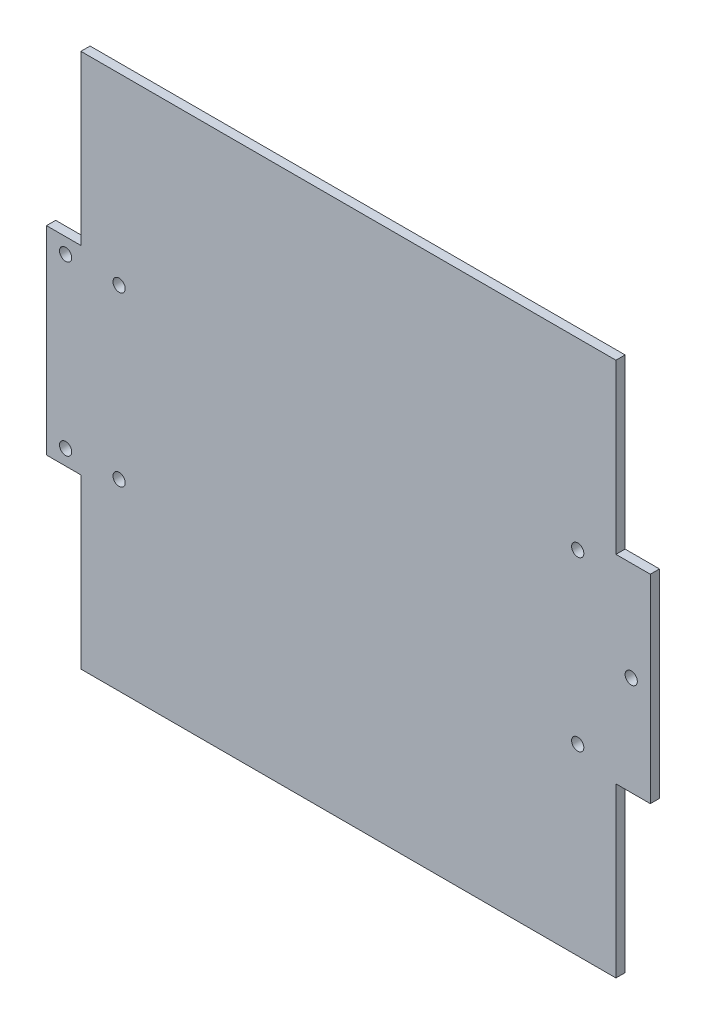
ISO-10303-21;
HEADER;
FILE_DESCRIPTION(('STEP AP214'),'2;1');
FILE_NAME('part.step','',(''),(''),'','','');
FILE_SCHEMA(('AUTOMOTIVE_DESIGN { 1 0 10303 214 1 1 1 1 }'));
ENDSEC;
DATA;
#1=APPLICATION_CONTEXT('core data for automotive mechanical design processes');
#2=APPLICATION_PROTOCOL_DEFINITION('international standard','automotive_design',2000,#1);
#3=PRODUCT_CONTEXT('',#1,'mechanical');
#4=PRODUCT('Part','Part','',(#3));
#5=PRODUCT_RELATED_PRODUCT_CATEGORY('part','',(#4));
#6=PRODUCT_DEFINITION_FORMATION('','',#4);
#7=PRODUCT_DEFINITION_CONTEXT('part definition',#1,'design');
#8=PRODUCT_DEFINITION('design','',#6,#7);
#9=PRODUCT_DEFINITION_SHAPE('','',#8);
#10=(LENGTH_UNIT() NAMED_UNIT(*) SI_UNIT(.MILLI.,.METRE.));
#11=(NAMED_UNIT(*) PLANE_ANGLE_UNIT() SI_UNIT($,.RADIAN.));
#12=(NAMED_UNIT(*) SI_UNIT($,.STERADIAN.) SOLID_ANGLE_UNIT());
#13=UNCERTAINTY_MEASURE_WITH_UNIT(LENGTH_MEASURE(1.E-05),#10,'distance_accuracy_value','');
#14=(GEOMETRIC_REPRESENTATION_CONTEXT(3) GLOBAL_UNCERTAINTY_ASSIGNED_CONTEXT((#13)) GLOBAL_UNIT_ASSIGNED_CONTEXT((#10,
#11,#12)) REPRESENTATION_CONTEXT('',''));
#15=CARTESIAN_POINT('',(0.,0.,0.));
#16=DIRECTION('',(0.,0.,1.));
#17=DIRECTION('',(1.,0.,0.));
#18=AXIS2_PLACEMENT_3D('',#15,#16,#17);
#19=CARTESIAN_POINT('',(0.,0.,2.4));
#20=DIRECTION('',(1.,0.,0.));
#21=DIRECTION('',(0.,1.,0.));
#22=AXIS2_PLACEMENT_3D('',#19,#20,#21);
#23=PLANE('',#22);
#24=DIRECTION('',(0.,-1.,0.));
#25=VECTOR('',#24,1.);
#26=CARTESIAN_POINT('',(0.,0.,0.));
#27=LINE('',#26,#25);
#28=CARTESIAN_POINT('',(0.,44.,0.));
#29=VERTEX_POINT('',#28);
#30=CARTESIAN_POINT('',(0.,0.,0.));
#31=VERTEX_POINT('',#30);
#32=EDGE_CURVE('E154',#29,#31,#27,.T.);
#33=ORIENTED_EDGE('',*,*,#32,.T.);
#34=DIRECTION('',(0.,0.,-1.));
#35=VECTOR('',#34,1.);
#36=CARTESIAN_POINT('',(0.,0.,2.4));
#37=LINE('',#36,#35);
#38=CARTESIAN_POINT('',(0.,0.,2.4));
#39=VERTEX_POINT('',#38);
#40=EDGE_CURVE('E11',#39,#31,#37,.T.);
#41=ORIENTED_EDGE('',*,*,#40,.F.);
#42=DIRECTION('',(0.,-1.,0.));
#43=VECTOR('',#42,1.);
#44=CARTESIAN_POINT('',(0.,0.,2.4));
#45=LINE('',#44,#43);
#46=CARTESIAN_POINT('',(0.,44.,2.4));
#47=VERTEX_POINT('',#46);
#48=EDGE_CURVE('E177',#47,#39,#45,.T.);
#49=ORIENTED_EDGE('',*,*,#48,.F.);
#50=DIRECTION('',(0.,0.,-1.));
#51=VECTOR('',#50,1.);
#52=CARTESIAN_POINT('',(0.,44.,2.4));
#53=LINE('',#52,#51);
#54=EDGE_CURVE('E150',#47,#29,#53,.T.);
#55=ORIENTED_EDGE('',*,*,#54,.T.);
#56=EDGE_LOOP('',(#33,#41,#49,#55));
#57=FACE_BOUND('',#56,.T.);
#58=ADVANCED_FACE('F34',(#57),#23,.F.);
#59=CARTESIAN_POINT('',(0.,0.,2.4));
#60=DIRECTION('',(0.,1.,0.));
#61=DIRECTION('',(-1.,0.,0.));
#62=AXIS2_PLACEMENT_3D('',#59,#60,#61);
#63=PLANE('',#62);
#64=DIRECTION('',(1.,0.,0.));
#65=VECTOR('',#64,1.);
#66=CARTESIAN_POINT('',(0.,0.,0.));
#67=LINE('',#66,#65);
#68=CARTESIAN_POINT('',(140.,0.,0.));
#69=VERTEX_POINT('',#68);
#70=EDGE_CURVE('E157',#31,#69,#67,.T.);
#71=ORIENTED_EDGE('',*,*,#70,.T.);
#72=DIRECTION('',(0.,0.,-1.));
#73=VECTOR('',#72,1.);
#74=CARTESIAN_POINT('',(140.,0.,2.4));
#75=LINE('',#74,#73);
#76=CARTESIAN_POINT('',(140.,0.,2.4));
#77=VERTEX_POINT('',#76);
#78=EDGE_CURVE('E42',#77,#69,#75,.T.);
#79=ORIENTED_EDGE('',*,*,#78,.F.);
#80=DIRECTION('',(1.,0.,0.));
#81=VECTOR('',#80,1.);
#82=CARTESIAN_POINT('',(0.,0.,2.4));
#83=LINE('',#82,#81);
#84=EDGE_CURVE('E105',#39,#77,#83,.T.);
#85=ORIENTED_EDGE('',*,*,#84,.F.);
#86=ORIENTED_EDGE('',*,*,#40,.T.);
#87=EDGE_LOOP('',(#71,#79,#85,#86));
#88=FACE_BOUND('',#87,.T.);
#89=ADVANCED_FACE('F256',(#88),#63,.F.);
#90=CARTESIAN_POINT('',(140.,0.,2.4));
#91=DIRECTION('',(-1.,0.,0.));
#92=DIRECTION('',(0.,0.,1.));
#93=AXIS2_PLACEMENT_3D('',#90,#91,#92);
#94=PLANE('',#93);
#95=DIRECTION('',(0.,1.,0.));
#96=VECTOR('',#95,1.);
#97=CARTESIAN_POINT('',(140.,0.,0.));
#98=LINE('',#97,#96);
#99=CARTESIAN_POINT('',(140.,44.,0.));
#100=VERTEX_POINT('',#99);
#101=EDGE_CURVE('E160',#69,#100,#98,.T.);
#102=ORIENTED_EDGE('',*,*,#101,.T.);
#103=DIRECTION('',(0.,0.,-1.));
#104=VECTOR('',#103,1.);
#105=CARTESIAN_POINT('',(140.,44.,2.4));
#106=LINE('',#105,#104);
#107=CARTESIAN_POINT('',(140.,44.,2.4));
#108=VERTEX_POINT('',#107);
#109=EDGE_CURVE('E196',#108,#100,#106,.T.);
#110=ORIENTED_EDGE('',*,*,#109,.F.);
#111=DIRECTION('',(0.,1.,0.));
#112=VECTOR('',#111,1.);
#113=CARTESIAN_POINT('',(140.,0.,2.4));
#114=LINE('',#113,#112);
#115=EDGE_CURVE('E204',#77,#108,#114,.T.);
#116=ORIENTED_EDGE('',*,*,#115,.F.);
#117=ORIENTED_EDGE('',*,*,#78,.T.);
#118=EDGE_LOOP('',(#102,#110,#116,#117));
#119=FACE_BOUND('',#118,.T.);
#120=ADVANCED_FACE('F202',(#119),#94,.F.);
#121=CARTESIAN_POINT('',(140.,44.,2.4));
#122=DIRECTION('',(0.,1.,0.));
#123=DIRECTION('',(-1.,0.,0.));
#124=AXIS2_PLACEMENT_3D('',#121,#122,#123);
#125=PLANE('',#124);
#126=DIRECTION('',(1.,0.,0.));
#127=VECTOR('',#126,1.);
#128=CARTESIAN_POINT('',(140.,44.,0.));
#129=LINE('',#128,#127);
#130=CARTESIAN_POINT('',(149.,44.,0.));
#131=VERTEX_POINT('',#130);
#132=EDGE_CURVE('E162',#100,#131,#129,.T.);
#133=ORIENTED_EDGE('',*,*,#132,.T.);
#134=DIRECTION('',(0.,0.,-1.));
#135=VECTOR('',#134,1.);
#136=CARTESIAN_POINT('',(149.,44.,2.4));
#137=LINE('',#136,#135);
#138=CARTESIAN_POINT('',(149.,44.,2.4));
#139=VERTEX_POINT('',#138);
#140=EDGE_CURVE('E193',#139,#131,#137,.T.);
#141=ORIENTED_EDGE('',*,*,#140,.F.);
#142=DIRECTION('',(1.,0.,0.));
#143=VECTOR('',#142,1.);
#144=CARTESIAN_POINT('',(140.,44.,2.4));
#145=LINE('',#144,#143);
#146=EDGE_CURVE('E222',#108,#139,#145,.T.);
#147=ORIENTED_EDGE('',*,*,#146,.F.);
#148=ORIENTED_EDGE('',*,*,#109,.T.);
#149=EDGE_LOOP('',(#133,#141,#147,#148));
#150=FACE_BOUND('',#149,.T.);
#151=ADVANCED_FACE('F213',(#150),#125,.F.);
#152=CARTESIAN_POINT('',(149.,44.,2.4));
#153=DIRECTION('',(-1.,0.,0.));
#154=DIRECTION('',(0.,0.,1.));
#155=AXIS2_PLACEMENT_3D('',#152,#153,#154);
#156=PLANE('',#155);
#157=DIRECTION('',(0.,1.,0.));
#158=VECTOR('',#157,1.);
#159=CARTESIAN_POINT('',(149.,44.,0.));
#160=LINE('',#159,#158);
#161=CARTESIAN_POINT('',(149.,96.,0.));
#162=VERTEX_POINT('',#161);
#163=EDGE_CURVE('E164',#131,#162,#160,.T.);
#164=ORIENTED_EDGE('',*,*,#163,.T.);
#165=DIRECTION('',(0.,0.,-1.));
#166=VECTOR('',#165,1.);
#167=CARTESIAN_POINT('',(149.,96.,2.4));
#168=LINE('',#167,#166);
#169=CARTESIAN_POINT('',(149.,96.,2.4));
#170=VERTEX_POINT('',#169);
#171=EDGE_CURVE('E190',#170,#162,#168,.T.);
#172=ORIENTED_EDGE('',*,*,#171,.F.);
#173=DIRECTION('',(0.,1.,0.));
#174=VECTOR('',#173,1.);
#175=CARTESIAN_POINT('',(149.,44.,2.4));
#176=LINE('',#175,#174);
#177=EDGE_CURVE('E219',#139,#170,#176,.T.);
#178=ORIENTED_EDGE('',*,*,#177,.F.);
#179=ORIENTED_EDGE('',*,*,#140,.T.);
#180=EDGE_LOOP('',(#164,#172,#178,#179));
#181=FACE_BOUND('',#180,.T.);
#182=ADVANCED_FACE('F217',(#181),#156,.F.);
#183=CARTESIAN_POINT('',(149.,96.,2.4));
#184=DIRECTION('',(0.,-1.,0.));
#185=DIRECTION('',(0.,0.,-1.));
#186=AXIS2_PLACEMENT_3D('',#183,#184,#185);
#187=PLANE('',#186);
#188=DIRECTION('',(-1.,0.,0.));
#189=VECTOR('',#188,1.);
#190=CARTESIAN_POINT('',(149.,96.,0.));
#191=LINE('',#190,#189);
#192=CARTESIAN_POINT('',(140.,96.,0.));
#193=VERTEX_POINT('',#192);
#194=EDGE_CURVE('E166',#162,#193,#191,.T.);
#195=ORIENTED_EDGE('',*,*,#194,.T.);
#196=DIRECTION('',(0.,0.,-1.));
#197=VECTOR('',#196,1.);
#198=CARTESIAN_POINT('',(140.,96.,2.4));
#199=LINE('',#198,#197);
#200=CARTESIAN_POINT('',(140.,96.,2.4));
#201=VERTEX_POINT('',#200);
#202=EDGE_CURVE('E187',#201,#193,#199,.T.);
#203=ORIENTED_EDGE('',*,*,#202,.F.);
#204=DIRECTION('',(-1.,0.,0.));
#205=VECTOR('',#204,1.);
#206=CARTESIAN_POINT('',(149.,96.,2.4));
#207=LINE('',#206,#205);
#208=EDGE_CURVE('E221',#170,#201,#207,.T.);
#209=ORIENTED_EDGE('',*,*,#208,.F.);
#210=ORIENTED_EDGE('',*,*,#171,.T.);
#211=EDGE_LOOP('',(#195,#203,#209,#210));
#212=FACE_BOUND('',#211,.T.);
#213=ADVANCED_FACE('F269',(#212),#187,.F.);
#214=CARTESIAN_POINT('',(140.,96.,2.4));
#215=DIRECTION('',(-1.,0.,0.));
#216=DIRECTION('',(0.,-1.,0.));
#217=AXIS2_PLACEMENT_3D('',#214,#215,#216);
#218=PLANE('',#217);
#219=DIRECTION('',(0.,1.,0.));
#220=VECTOR('',#219,1.);
#221=CARTESIAN_POINT('',(140.,96.,0.));
#222=LINE('',#221,#220);
#223=CARTESIAN_POINT('',(140.,140.,0.));
#224=VERTEX_POINT('',#223);
#225=EDGE_CURVE('E168',#193,#224,#222,.T.);
#226=ORIENTED_EDGE('',*,*,#225,.T.);
#227=DIRECTION('',(0.,0.,-1.));
#228=VECTOR('',#227,1.);
#229=CARTESIAN_POINT('',(140.,140.,2.4));
#230=LINE('',#229,#228);
#231=CARTESIAN_POINT('',(140.,140.,2.4));
#232=VERTEX_POINT('',#231);
#233=EDGE_CURVE('E184',#232,#224,#230,.T.);
#234=ORIENTED_EDGE('',*,*,#233,.F.);
#235=DIRECTION('',(0.,1.,0.));
#236=VECTOR('',#235,1.);
#237=CARTESIAN_POINT('',(140.,96.,2.4));
#238=LINE('',#237,#236);
#239=EDGE_CURVE('E224',#201,#232,#238,.T.);
#240=ORIENTED_EDGE('',*,*,#239,.F.);
#241=ORIENTED_EDGE('',*,*,#202,.T.);
#242=EDGE_LOOP('',(#226,#234,#240,#241));
#243=FACE_BOUND('',#242,.T.);
#244=ADVANCED_FACE('F272',(#243),#218,.F.);
#245=CARTESIAN_POINT('',(0.,140.,2.4));
#246=DIRECTION('',(0.,-1.,0.));
#247=DIRECTION('',(0.,0.,-1.));
#248=AXIS2_PLACEMENT_3D('',#245,#246,#247);
#249=PLANE('',#248);
#250=DIRECTION('',(-1.,0.,0.));
#251=VECTOR('',#250,1.);
#252=CARTESIAN_POINT('',(0.,140.,0.));
#253=LINE('',#252,#251);
#254=CARTESIAN_POINT('',(0.,140.,0.));
#255=VERTEX_POINT('',#254);
#256=EDGE_CURVE('E170',#224,#255,#253,.T.);
#257=ORIENTED_EDGE('',*,*,#256,.T.);
#258=DIRECTION('',(0.,0.,-1.));
#259=VECTOR('',#258,1.);
#260=CARTESIAN_POINT('',(0.,140.,2.4));
#261=LINE('',#260,#259);
#262=CARTESIAN_POINT('',(0.,140.,2.4));
#263=VERTEX_POINT('',#262);
#264=EDGE_CURVE('E181',#263,#255,#261,.T.);
#265=ORIENTED_EDGE('',*,*,#264,.F.);
#266=DIRECTION('',(-1.,0.,0.));
#267=VECTOR('',#266,1.);
#268=CARTESIAN_POINT('',(0.,140.,2.4));
#269=LINE('',#268,#267);
#270=EDGE_CURVE('E230',#232,#263,#269,.T.);
#271=ORIENTED_EDGE('',*,*,#270,.F.);
#272=ORIENTED_EDGE('',*,*,#233,.T.);
#273=EDGE_LOOP('',(#257,#265,#271,#272));
#274=FACE_BOUND('',#273,.T.);
#275=ADVANCED_FACE('F236',(#274),#249,.F.);
#276=CARTESIAN_POINT('',(0.,96.,2.4));
#277=DIRECTION('',(1.,0.,0.));
#278=DIRECTION('',(0.,0.,-1.));
#279=AXIS2_PLACEMENT_3D('',#276,#277,#278);
#280=PLANE('',#279);
#281=DIRECTION('',(0.,-1.,0.));
#282=VECTOR('',#281,1.);
#283=CARTESIAN_POINT('',(0.,96.,0.));
#284=LINE('',#283,#282);
#285=CARTESIAN_POINT('',(0.,96.,0.));
#286=VERTEX_POINT('',#285);
#287=EDGE_CURVE('E172',#255,#286,#284,.T.);
#288=ORIENTED_EDGE('',*,*,#287,.T.);
#289=DIRECTION('',(0.,0.,-1.));
#290=VECTOR('',#289,1.);
#291=CARTESIAN_POINT('',(0.,96.,2.4));
#292=LINE('',#291,#290);
#293=CARTESIAN_POINT('',(0.,96.,2.4));
#294=VERTEX_POINT('',#293);
#295=EDGE_CURVE('E145',#294,#286,#292,.T.);
#296=ORIENTED_EDGE('',*,*,#295,.F.);
#297=DIRECTION('',(0.,-1.,0.));
#298=VECTOR('',#297,1.);
#299=CARTESIAN_POINT('',(0.,96.,2.4));
#300=LINE('',#299,#298);
#301=EDGE_CURVE('E136',#263,#294,#300,.T.);
#302=ORIENTED_EDGE('',*,*,#301,.F.);
#303=ORIENTED_EDGE('',*,*,#264,.T.);
#304=EDGE_LOOP('',(#288,#296,#302,#303));
#305=FACE_BOUND('',#304,.T.);
#306=ADVANCED_FACE('F240',(#305),#280,.F.);
#307=CARTESIAN_POINT('',(0.,96.,2.4));
#308=DIRECTION('',(0.,-1.,0.));
#309=DIRECTION('',(1.,0.,0.));
#310=AXIS2_PLACEMENT_3D('',#307,#308,#309);
#311=PLANE('',#310);
#312=DIRECTION('',(-1.,0.,0.));
#313=VECTOR('',#312,1.);
#314=CARTESIAN_POINT('',(0.,96.,0.));
#315=LINE('',#314,#313);
#316=CARTESIAN_POINT('',(-9.,96.,0.));
#317=VERTEX_POINT('',#316);
#318=EDGE_CURVE('E144',#286,#317,#315,.T.);
#319=ORIENTED_EDGE('',*,*,#318,.T.);
#320=DIRECTION('',(0.,0.,-1.));
#321=VECTOR('',#320,1.);
#322=CARTESIAN_POINT('',(-9.,96.,2.4));
#323=LINE('',#322,#321);
#324=CARTESIAN_POINT('',(-9.,96.,2.4));
#325=VERTEX_POINT('',#324);
#326=EDGE_CURVE('E141',#325,#317,#323,.T.);
#327=ORIENTED_EDGE('',*,*,#326,.F.);
#328=DIRECTION('',(-1.,0.,0.));
#329=VECTOR('',#328,1.);
#330=CARTESIAN_POINT('',(0.,96.,2.4));
#331=LINE('',#330,#329);
#332=EDGE_CURVE('E130',#294,#325,#331,.T.);
#333=ORIENTED_EDGE('',*,*,#332,.F.);
#334=ORIENTED_EDGE('',*,*,#295,.T.);
#335=EDGE_LOOP('',(#319,#327,#333,#334));
#336=FACE_BOUND('',#335,.T.);
#337=ADVANCED_FACE('F142',(#336),#311,.F.);
#338=CARTESIAN_POINT('',(-9.,96.,2.4));
#339=DIRECTION('',(1.,0.,0.));
#340=DIRECTION('',(0.,1.,0.));
#341=AXIS2_PLACEMENT_3D('',#338,#339,#340);
#342=PLANE('',#341);
#343=DIRECTION('',(0.,-1.,0.));
#344=VECTOR('',#343,1.);
#345=CARTESIAN_POINT('',(-9.,96.,0.));
#346=LINE('',#345,#344);
#347=CARTESIAN_POINT('',(-8.99999999999999,44.,0.));
#348=VERTEX_POINT('',#347);
#349=EDGE_CURVE('E91',#317,#348,#346,.T.);
#350=ORIENTED_EDGE('',*,*,#349,.T.);
#351=DIRECTION('',(0.,0.,-1.));
#352=VECTOR('',#351,1.);
#353=CARTESIAN_POINT('',(-8.99999999999999,44.,2.4));
#354=LINE('',#353,#352);
#355=CARTESIAN_POINT('',(-8.99999999999999,44.,2.4));
#356=VERTEX_POINT('',#355);
#357=EDGE_CURVE('E146',#356,#348,#354,.T.);
#358=ORIENTED_EDGE('',*,*,#357,.F.);
#359=DIRECTION('',(0.,-1.,0.));
#360=VECTOR('',#359,1.);
#361=CARTESIAN_POINT('',(-9.,96.,2.4));
#362=LINE('',#361,#360);
#363=EDGE_CURVE('E134',#325,#356,#362,.T.);
#364=ORIENTED_EDGE('',*,*,#363,.F.);
#365=ORIENTED_EDGE('',*,*,#326,.T.);
#366=EDGE_LOOP('',(#350,#358,#364,#365));
#367=FACE_BOUND('',#366,.T.);
#368=ADVANCED_FACE('F148',(#367),#342,.F.);
#369=CARTESIAN_POINT('',(-8.99999999999999,44.,2.4));
#370=DIRECTION('',(0.,1.,0.));
#371=DIRECTION('',(-1.,0.,0.));
#372=AXIS2_PLACEMENT_3D('',#369,#370,#371);
#373=PLANE('',#372);
#374=DIRECTION('',(1.,0.,0.));
#375=VECTOR('',#374,1.);
#376=CARTESIAN_POINT('',(-8.99999999999999,44.,0.));
#377=LINE('',#376,#375);
#378=EDGE_CURVE('E97',#348,#29,#377,.T.);
#379=ORIENTED_EDGE('',*,*,#378,.T.);
#380=ORIENTED_EDGE('',*,*,#54,.F.);
#381=DIRECTION('',(1.,0.,0.));
#382=VECTOR('',#381,1.);
#383=CARTESIAN_POINT('',(-8.99999999999999,44.,2.4));
#384=LINE('',#383,#382);
#385=EDGE_CURVE('E50',#356,#47,#384,.T.);
#386=ORIENTED_EDGE('',*,*,#385,.F.);
#387=ORIENTED_EDGE('',*,*,#357,.T.);
#388=EDGE_LOOP('',(#379,#380,#386,#387));
#389=FACE_BOUND('',#388,.T.);
#390=ADVANCED_FACE('F244',(#389),#373,.F.);
#391=CARTESIAN_POINT('',(0.,44.,2.4));
#392=DIRECTION('',(0.,0.,-1.));
#393=DIRECTION('',(-1.,0.,0.));
#394=AXIS2_PLACEMENT_3D('',#391,#392,#393);
#395=PLANE('',#394);
#396=CARTESIAN_POINT('',(144.,70.,2.4));
#397=DIRECTION('',(0.,0.,1.));
#398=DIRECTION('',(1.,0.,0.));
#399=AXIS2_PLACEMENT_3D('',#396,#397,#398);
#400=CIRCLE('',#399,1.59999999999999);
#401=CARTESIAN_POINT('',(145.6,70.,2.4));
#402=VERTEX_POINT('',#401);
#403=EDGE_CURVE('E388',#402,#402,#400,.T.);
#404=ORIENTED_EDGE('',*,*,#403,.F.);
#405=EDGE_LOOP('',(#404));
#406=FACE_BOUND('',#405,.T.);
#407=CARTESIAN_POINT('',(-3.99999999999996,48.,2.4));
#408=DIRECTION('',(0.,0.,1.));
#409=DIRECTION('',(1.,0.,0.));
#410=AXIS2_PLACEMENT_3D('',#407,#408,#409);
#411=CIRCLE('',#410,1.6);
#412=CARTESIAN_POINT('',(-2.39999999999997,48.,2.4));
#413=VERTEX_POINT('',#412);
#414=EDGE_CURVE('E390',#413,#413,#411,.T.);
#415=ORIENTED_EDGE('',*,*,#414,.F.);
#416=EDGE_LOOP('',(#415));
#417=FACE_BOUND('',#416,.T.);
#418=CARTESIAN_POINT('',(-3.99999999999997,92.,2.4));
#419=DIRECTION('',(0.,0.,1.));
#420=DIRECTION('',(1.,0.,0.));
#421=AXIS2_PLACEMENT_3D('',#418,#419,#420);
#422=CIRCLE('',#421,1.6);
#423=CARTESIAN_POINT('',(-2.39999999999997,92.,2.4));
#424=VERTEX_POINT('',#423);
#425=EDGE_CURVE('E396',#424,#424,#422,.T.);
#426=ORIENTED_EDGE('',*,*,#425,.F.);
#427=EDGE_LOOP('',(#426));
#428=FACE_BOUND('',#427,.T.);
#429=CARTESIAN_POINT('',(130.,92.,2.4));
#430=DIRECTION('',(0.,0.,-1.));
#431=DIRECTION('',(-1.,0.,0.));
#432=AXIS2_PLACEMENT_3D('',#429,#430,#431);
#433=CIRCLE('',#432,1.59999999999999);
#434=CARTESIAN_POINT('',(128.4,92.,2.4));
#435=VERTEX_POINT('',#434);
#436=EDGE_CURVE('E407',#435,#435,#433,.T.);
#437=ORIENTED_EDGE('',*,*,#436,.T.);
#438=EDGE_LOOP('',(#437));
#439=FACE_BOUND('',#438,.T.);
#440=CARTESIAN_POINT('',(130.,48.,2.4));
#441=DIRECTION('',(0.,0.,-1.));
#442=DIRECTION('',(-1.,0.,0.));
#443=AXIS2_PLACEMENT_3D('',#440,#441,#442);
#444=CIRCLE('',#443,1.59999999999999);
#445=CARTESIAN_POINT('',(128.4,48.,2.4));
#446=VERTEX_POINT('',#445);
#447=EDGE_CURVE('E413',#446,#446,#444,.T.);
#448=ORIENTED_EDGE('',*,*,#447,.T.);
#449=EDGE_LOOP('',(#448));
#450=FACE_BOUND('',#449,.T.);
#451=CARTESIAN_POINT('',(10.,92.,2.4));
#452=DIRECTION('',(0.,0.,-1.));
#453=DIRECTION('',(-1.,0.,0.));
#454=AXIS2_PLACEMENT_3D('',#451,#452,#453);
#455=CIRCLE('',#454,1.6);
#456=CARTESIAN_POINT('',(8.40000000000005,92.,2.4));
#457=VERTEX_POINT('',#456);
#458=EDGE_CURVE('E419',#457,#457,#455,.T.);
#459=ORIENTED_EDGE('',*,*,#458,.T.);
#460=EDGE_LOOP('',(#459));
#461=FACE_BOUND('',#460,.T.);
#462=CARTESIAN_POINT('',(10.,48.,2.4));
#463=DIRECTION('',(0.,0.,-1.));
#464=DIRECTION('',(-1.,0.,0.));
#465=AXIS2_PLACEMENT_3D('',#462,#463,#464);
#466=CIRCLE('',#465,1.6);
#467=CARTESIAN_POINT('',(8.40000000000004,48.,2.4));
#468=VERTEX_POINT('',#467);
#469=EDGE_CURVE('E158',#468,#468,#466,.T.);
#470=ORIENTED_EDGE('',*,*,#469,.T.);
#471=EDGE_LOOP('',(#470));
#472=FACE_BOUND('',#471,.T.);
#473=ORIENTED_EDGE('',*,*,#48,.T.);
#474=ORIENTED_EDGE('',*,*,#84,.T.);
#475=ORIENTED_EDGE('',*,*,#115,.T.);
#476=ORIENTED_EDGE('',*,*,#146,.T.);
#477=ORIENTED_EDGE('',*,*,#177,.T.);
#478=ORIENTED_EDGE('',*,*,#208,.T.);
#479=ORIENTED_EDGE('',*,*,#239,.T.);
#480=ORIENTED_EDGE('',*,*,#270,.T.);
#481=ORIENTED_EDGE('',*,*,#301,.T.);
#482=ORIENTED_EDGE('',*,*,#332,.T.);
#483=ORIENTED_EDGE('',*,*,#363,.T.);
#484=ORIENTED_EDGE('',*,*,#385,.T.);
#485=EDGE_LOOP('',(#473,#474,#475,#476,#477,#478,#479,#480,#481,#482,#483,#484));
#486=FACE_BOUND('',#485,.T.);
#487=ADVANCED_FACE('F132',(#406,#417,#428,#439,#450,#461,#472,#486),#395,.F.);
#488=CARTESIAN_POINT('',(0.,44.,0.));
#489=DIRECTION('',(0.,0.,-1.));
#490=DIRECTION('',(-1.,0.,0.));
#491=AXIS2_PLACEMENT_3D('',#488,#489,#490);
#492=PLANE('',#491);
#493=CARTESIAN_POINT('',(144.,70.,0.));
#494=DIRECTION('',(0.,0.,1.));
#495=DIRECTION('',(1.,0.,0.));
#496=AXIS2_PLACEMENT_3D('',#493,#494,#495);
#497=CIRCLE('',#496,1.59999999999999);
#498=CARTESIAN_POINT('',(145.6,70.,0.));
#499=VERTEX_POINT('',#498);
#500=EDGE_CURVE('E385',#499,#499,#497,.T.);
#501=ORIENTED_EDGE('',*,*,#500,.T.);
#502=EDGE_LOOP('',(#501));
#503=FACE_BOUND('',#502,.T.);
#504=CARTESIAN_POINT('',(-3.99999999999996,48.,0.));
#505=DIRECTION('',(0.,0.,1.));
#506=DIRECTION('',(1.,0.,0.));
#507=AXIS2_PLACEMENT_3D('',#504,#505,#506);
#508=CIRCLE('',#507,1.6);
#509=CARTESIAN_POINT('',(-2.39999999999997,48.,0.));
#510=VERTEX_POINT('',#509);
#511=EDGE_CURVE('E393',#510,#510,#508,.T.);
#512=ORIENTED_EDGE('',*,*,#511,.T.);
#513=EDGE_LOOP('',(#512));
#514=FACE_BOUND('',#513,.T.);
#515=CARTESIAN_POINT('',(-3.99999999999997,92.,0.));
#516=DIRECTION('',(0.,0.,1.));
#517=DIRECTION('',(1.,0.,0.));
#518=AXIS2_PLACEMENT_3D('',#515,#516,#517);
#519=CIRCLE('',#518,1.6);
#520=CARTESIAN_POINT('',(-2.39999999999997,92.,0.));
#521=VERTEX_POINT('',#520);
#522=EDGE_CURVE('E399',#521,#521,#519,.T.);
#523=ORIENTED_EDGE('',*,*,#522,.T.);
#524=EDGE_LOOP('',(#523));
#525=FACE_BOUND('',#524,.T.);
#526=CARTESIAN_POINT('',(130.,92.,0.));
#527=DIRECTION('',(0.,0.,-1.));
#528=DIRECTION('',(-1.,0.,0.));
#529=AXIS2_PLACEMENT_3D('',#526,#527,#528);
#530=CIRCLE('',#529,1.59999999999999);
#531=CARTESIAN_POINT('',(128.4,92.,0.));
#532=VERTEX_POINT('',#531);
#533=EDGE_CURVE('E402',#532,#532,#530,.T.);
#534=ORIENTED_EDGE('',*,*,#533,.F.);
#535=EDGE_LOOP('',(#534));
#536=FACE_BOUND('',#535,.T.);
#537=CARTESIAN_POINT('',(130.,48.,0.));
#538=DIRECTION('',(0.,0.,-1.));
#539=DIRECTION('',(-1.,0.,0.));
#540=AXIS2_PLACEMENT_3D('',#537,#538,#539);
#541=CIRCLE('',#540,1.59999999999999);
#542=CARTESIAN_POINT('',(128.4,48.,0.));
#543=VERTEX_POINT('',#542);
#544=EDGE_CURVE('E410',#543,#543,#541,.T.);
#545=ORIENTED_EDGE('',*,*,#544,.F.);
#546=EDGE_LOOP('',(#545));
#547=FACE_BOUND('',#546,.T.);
#548=CARTESIAN_POINT('',(10.,92.,0.));
#549=DIRECTION('',(0.,0.,-1.));
#550=DIRECTION('',(-1.,0.,0.));
#551=AXIS2_PLACEMENT_3D('',#548,#549,#550);
#552=CIRCLE('',#551,1.6);
#553=CARTESIAN_POINT('',(8.40000000000005,92.,0.));
#554=VERTEX_POINT('',#553);
#555=EDGE_CURVE('E416',#554,#554,#552,.T.);
#556=ORIENTED_EDGE('',*,*,#555,.F.);
#557=EDGE_LOOP('',(#556));
#558=FACE_BOUND('',#557,.T.);
#559=CARTESIAN_POINT('',(10.,48.,0.));
#560=DIRECTION('',(0.,0.,-1.));
#561=DIRECTION('',(-1.,0.,0.));
#562=AXIS2_PLACEMENT_3D('',#559,#560,#561);
#563=CIRCLE('',#562,1.6);
#564=CARTESIAN_POINT('',(8.40000000000004,48.,0.));
#565=VERTEX_POINT('',#564);
#566=EDGE_CURVE('E422',#565,#565,#563,.T.);
#567=ORIENTED_EDGE('',*,*,#566,.F.);
#568=EDGE_LOOP('',(#567));
#569=FACE_BOUND('',#568,.T.);
#570=ORIENTED_EDGE('',*,*,#32,.F.);
#571=ORIENTED_EDGE('',*,*,#378,.F.);
#572=ORIENTED_EDGE('',*,*,#349,.F.);
#573=ORIENTED_EDGE('',*,*,#318,.F.);
#574=ORIENTED_EDGE('',*,*,#287,.F.);
#575=ORIENTED_EDGE('',*,*,#256,.F.);
#576=ORIENTED_EDGE('',*,*,#225,.F.);
#577=ORIENTED_EDGE('',*,*,#194,.F.);
#578=ORIENTED_EDGE('',*,*,#163,.F.);
#579=ORIENTED_EDGE('',*,*,#132,.F.);
#580=ORIENTED_EDGE('',*,*,#101,.F.);
#581=ORIENTED_EDGE('',*,*,#70,.F.);
#582=EDGE_LOOP('',(#570,#571,#572,#573,#574,#575,#576,#577,#578,#579,#580,#581));
#583=FACE_BOUND('',#582,.T.);
#584=ADVANCED_FACE('F208',(#503,#514,#525,#536,#547,#558,#569,#583),#492,.T.);
#585=CARTESIAN_POINT('',(10.,48.,0.));
#586=DIRECTION('',(0.,0.,-1.));
#587=DIRECTION('',(-1.,0.,0.));
#588=AXIS2_PLACEMENT_3D('',#585,#586,#587);
#589=CYLINDRICAL_SURFACE('',#588,1.6);
#590=ORIENTED_EDGE('',*,*,#566,.T.);
#591=EDGE_LOOP('',(#590));
#592=FACE_BOUND('',#591,.T.);
#593=ORIENTED_EDGE('',*,*,#469,.F.);
#594=EDGE_LOOP('',(#593));
#595=FACE_BOUND('',#594,.T.);
#596=ADVANCED_FACE('F300',(#592,#595),#589,.F.);
#597=CARTESIAN_POINT('',(10.,92.,0.));
#598=DIRECTION('',(0.,0.,-1.));
#599=DIRECTION('',(-1.,0.,0.));
#600=AXIS2_PLACEMENT_3D('',#597,#598,#599);
#601=CYLINDRICAL_SURFACE('',#600,1.6);
#602=ORIENTED_EDGE('',*,*,#555,.T.);
#603=EDGE_LOOP('',(#602));
#604=FACE_BOUND('',#603,.T.);
#605=ORIENTED_EDGE('',*,*,#458,.F.);
#606=EDGE_LOOP('',(#605));
#607=FACE_BOUND('',#606,.T.);
#608=ADVANCED_FACE('F305',(#604,#607),#601,.F.);
#609=CARTESIAN_POINT('',(130.,48.,0.));
#610=DIRECTION('',(0.,0.,-1.));
#611=DIRECTION('',(-1.,0.,0.));
#612=AXIS2_PLACEMENT_3D('',#609,#610,#611);
#613=CYLINDRICAL_SURFACE('',#612,1.59999999999999);
#614=ORIENTED_EDGE('',*,*,#544,.T.);
#615=EDGE_LOOP('',(#614));
#616=FACE_BOUND('',#615,.T.);
#617=ORIENTED_EDGE('',*,*,#447,.F.);
#618=EDGE_LOOP('',(#617));
#619=FACE_BOUND('',#618,.T.);
#620=ADVANCED_FACE('F317',(#616,#619),#613,.F.);
#621=CARTESIAN_POINT('',(130.,92.,0.));
#622=DIRECTION('',(0.,0.,-1.));
#623=DIRECTION('',(-1.,0.,0.));
#624=AXIS2_PLACEMENT_3D('',#621,#622,#623);
#625=CYLINDRICAL_SURFACE('',#624,1.59999999999999);
#626=ORIENTED_EDGE('',*,*,#533,.T.);
#627=EDGE_LOOP('',(#626));
#628=FACE_BOUND('',#627,.T.);
#629=ORIENTED_EDGE('',*,*,#436,.F.);
#630=EDGE_LOOP('',(#629));
#631=FACE_BOUND('',#630,.T.);
#632=ADVANCED_FACE('F327',(#628,#631),#625,.F.);
#633=CARTESIAN_POINT('',(-3.99999999999997,92.,0.));
#634=DIRECTION('',(0.,0.,1.));
#635=DIRECTION('',(1.,0.,0.));
#636=AXIS2_PLACEMENT_3D('',#633,#634,#635);
#637=CYLINDRICAL_SURFACE('',#636,1.6);
#638=ORIENTED_EDGE('',*,*,#522,.F.);
#639=EDGE_LOOP('',(#638));
#640=FACE_BOUND('',#639,.T.);
#641=ORIENTED_EDGE('',*,*,#425,.T.);
#642=EDGE_LOOP('',(#641));
#643=FACE_BOUND('',#642,.T.);
#644=ADVANCED_FACE('F337',(#640,#643),#637,.F.);
#645=CARTESIAN_POINT('',(-3.99999999999996,48.,0.));
#646=DIRECTION('',(0.,0.,1.));
#647=DIRECTION('',(1.,0.,0.));
#648=AXIS2_PLACEMENT_3D('',#645,#646,#647);
#649=CYLINDRICAL_SURFACE('',#648,1.6);
#650=ORIENTED_EDGE('',*,*,#511,.F.);
#651=EDGE_LOOP('',(#650));
#652=FACE_BOUND('',#651,.T.);
#653=ORIENTED_EDGE('',*,*,#414,.T.);
#654=EDGE_LOOP('',(#653));
#655=FACE_BOUND('',#654,.T.);
#656=ADVANCED_FACE('F358',(#652,#655),#649,.F.);
#657=CARTESIAN_POINT('',(144.,70.,0.));
#658=DIRECTION('',(0.,0.,1.));
#659=DIRECTION('',(1.,0.,0.));
#660=AXIS2_PLACEMENT_3D('',#657,#658,#659);
#661=CYLINDRICAL_SURFACE('',#660,1.59999999999999);
#662=ORIENTED_EDGE('',*,*,#500,.F.);
#663=EDGE_LOOP('',(#662));
#664=FACE_BOUND('',#663,.T.);
#665=ORIENTED_EDGE('',*,*,#403,.T.);
#666=EDGE_LOOP('',(#665));
#667=FACE_BOUND('',#666,.T.);
#668=ADVANCED_FACE('F368',(#664,#667),#661,.F.);
#669=CLOSED_SHELL('',(#58,#89,#120,#151,#182,#213,#244,#275,#306,#337,#368,#390,#487,#584,#596,
#608,#620,#632,#644,#656,#668));
#670=MANIFOLD_SOLID_BREP('B2',#669);
#671=ADVANCED_BREP_SHAPE_REPRESENTATION('',(#18,#670),#14);
#672=SHAPE_DEFINITION_REPRESENTATION(#9,#671);
ENDSEC;
END-ISO-10303-21;
